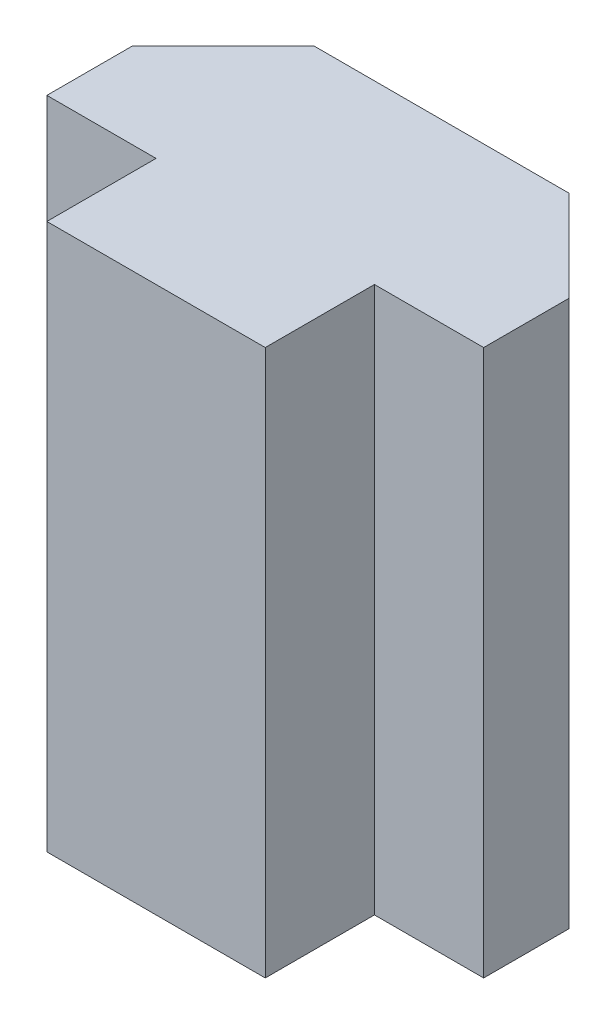
ISO-10303-21;
HEADER;
FILE_DESCRIPTION(('STEP AP214'),'2;1');
FILE_NAME('part.step','',(''),(''),'','','');
FILE_SCHEMA(('AUTOMOTIVE_DESIGN { 1 0 10303 214 1 1 1 1 }'));
ENDSEC;
DATA;
#1=APPLICATION_CONTEXT('core data for automotive mechanical design processes');
#2=APPLICATION_PROTOCOL_DEFINITION('international standard','automotive_design',2000,#1);
#3=PRODUCT_CONTEXT('',#1,'mechanical');
#4=PRODUCT('Part','Part','',(#3));
#5=PRODUCT_RELATED_PRODUCT_CATEGORY('part','',(#4));
#6=PRODUCT_DEFINITION_FORMATION('','',#4);
#7=PRODUCT_DEFINITION_CONTEXT('part definition',#1,'design');
#8=PRODUCT_DEFINITION('design','',#6,#7);
#9=PRODUCT_DEFINITION_SHAPE('','',#8);
#10=(LENGTH_UNIT() NAMED_UNIT(*) SI_UNIT(.MILLI.,.METRE.));
#11=(NAMED_UNIT(*) PLANE_ANGLE_UNIT() SI_UNIT($,.RADIAN.));
#12=(NAMED_UNIT(*) SI_UNIT($,.STERADIAN.) SOLID_ANGLE_UNIT());
#13=UNCERTAINTY_MEASURE_WITH_UNIT(LENGTH_MEASURE(1.E-05),#10,'distance_accuracy_value','');
#14=(GEOMETRIC_REPRESENTATION_CONTEXT(3) GLOBAL_UNCERTAINTY_ASSIGNED_CONTEXT((#13)) GLOBAL_UNIT_ASSIGNED_CONTEXT((#10,
#11,#12)) REPRESENTATION_CONTEXT('',''));
#15=CARTESIAN_POINT('',(0.,0.,0.));
#16=DIRECTION('',(0.,0.,1.));
#17=DIRECTION('',(1.,0.,0.));
#18=AXIS2_PLACEMENT_3D('',#15,#16,#17);
#19=CARTESIAN_POINT('',(-1.74789245707196,0.,0.));
#20=DIRECTION('',(1.,0.,0.));
#21=DIRECTION('',(0.,1.,0.));
#22=AXIS2_PLACEMENT_3D('',#19,#20,#21);
#23=PLANE('',#22);
#24=DIRECTION('',(0.,-1.,0.));
#25=VECTOR('',#24,1.);
#26=CARTESIAN_POINT('',(-1.74789245707196,20.,4.));
#27=LINE('',#26,#25);
#28=CARTESIAN_POINT('',(-1.74789245707196,20.,4.));
#29=VERTEX_POINT('',#28);
#30=CARTESIAN_POINT('',(-1.74789245707196,0.,4.));
#31=VERTEX_POINT('',#30);
#32=EDGE_CURVE('E114',#29,#31,#27,.T.);
#33=ORIENTED_EDGE('',*,*,#32,.F.);
#34=DIRECTION('',(0.,0.,1.));
#35=VECTOR('',#34,1.);
#36=CARTESIAN_POINT('',(-1.74789245707196,20.,0.));
#37=LINE('',#36,#35);
#38=CARTESIAN_POINT('',(-1.74789245707196,20.,0.));
#39=VERTEX_POINT('',#38);
#40=EDGE_CURVE('E180',#39,#29,#37,.T.);
#41=ORIENTED_EDGE('',*,*,#40,.F.);
#42=DIRECTION('',(0.,-1.,0.));
#43=VECTOR('',#42,1.);
#44=CARTESIAN_POINT('',(-1.74789245707197,40.,0.));
#45=LINE('',#44,#43);
#46=CARTESIAN_POINT('',(-1.74789245707196,0.,0.));
#47=VERTEX_POINT('',#46);
#48=EDGE_CURVE('E130',#39,#47,#45,.T.);
#49=ORIENTED_EDGE('',*,*,#48,.T.);
#50=DIRECTION('',(0.,0.,1.));
#51=VECTOR('',#50,1.);
#52=CARTESIAN_POINT('',(-1.74789245707196,0.,5.));
#53=LINE('',#52,#51);
#54=EDGE_CURVE('E126',#47,#31,#53,.T.);
#55=ORIENTED_EDGE('',*,*,#54,.T.);
#56=EDGE_LOOP('',(#33,#41,#49,#55));
#57=FACE_BOUND('',#56,.T.);
#58=ADVANCED_FACE('F38',(#57),#23,.F.);
#59=CARTESIAN_POINT('',(6.25210754292804,0.,0.));
#60=DIRECTION('',(1.,0.,0.));
#61=DIRECTION('',(0.,1.,0.));
#62=AXIS2_PLACEMENT_3D('',#59,#60,#61);
#63=PLANE('',#62);
#64=DIRECTION('',(0.,0.,1.));
#65=VECTOR('',#64,1.);
#66=CARTESIAN_POINT('',(6.25210754292804,20.,0.));
#67=LINE('',#66,#65);
#68=CARTESIAN_POINT('',(6.25210754292804,20.,0.));
#69=VERTEX_POINT('',#68);
#70=CARTESIAN_POINT('',(6.25210754292804,20.,4.));
#71=VERTEX_POINT('',#70);
#72=EDGE_CURVE('E11',#69,#71,#67,.T.);
#73=ORIENTED_EDGE('',*,*,#72,.T.);
#74=DIRECTION('',(0.,1.,0.));
#75=VECTOR('',#74,1.);
#76=CARTESIAN_POINT('',(6.25210754292804,20.,4.));
#77=LINE('',#76,#75);
#78=CARTESIAN_POINT('',(6.25210754292804,0.,4.));
#79=VERTEX_POINT('',#78);
#80=EDGE_CURVE('E53',#79,#71,#77,.T.);
#81=ORIENTED_EDGE('',*,*,#80,.F.);
#82=DIRECTION('',(0.,0.,-1.));
#83=VECTOR('',#82,1.);
#84=CARTESIAN_POINT('',(6.25210754292804,0.,5.));
#85=LINE('',#84,#83);
#86=CARTESIAN_POINT('',(6.25210754292804,0.,0.));
#87=VERTEX_POINT('',#86);
#88=EDGE_CURVE('E60',#79,#87,#85,.T.);
#89=ORIENTED_EDGE('',*,*,#88,.T.);
#90=DIRECTION('',(0.,1.,0.));
#91=VECTOR('',#90,1.);
#92=CARTESIAN_POINT('',(6.25210754292803,40.,0.));
#93=LINE('',#92,#91);
#94=EDGE_CURVE('E136',#87,#69,#93,.T.);
#95=ORIENTED_EDGE('',*,*,#94,.T.);
#96=EDGE_LOOP('',(#73,#81,#89,#95));
#97=FACE_BOUND('',#96,.T.);
#98=ADVANCED_FACE('F194',(#97),#63,.T.);
#99=CARTESIAN_POINT('',(0.,0.,0.));
#100=DIRECTION('',(0.,1.,0.));
#101=DIRECTION('',(0.,0.,1.));
#102=AXIS2_PLACEMENT_3D('',#99,#100,#101);
#103=PLANE('',#102);
#104=DIRECTION('',(1.,0.,0.));
#105=VECTOR('',#104,1.);
#106=CARTESIAN_POINT('',(-1.74789245707196,0.,4.));
#107=LINE('',#106,#105);
#108=EDGE_CURVE('E117',#31,#79,#107,.T.);
#109=ORIENTED_EDGE('',*,*,#108,.F.);
#110=ORIENTED_EDGE('',*,*,#54,.F.);
#111=DIRECTION('',(-1.,0.,0.));
#112=VECTOR('',#111,1.);
#113=CARTESIAN_POINT('',(9.75210754292804,0.,0.));
#114=LINE('',#113,#112);
#115=CARTESIAN_POINT('',(-5.74789245707196,0.,0.));
#116=VERTEX_POINT('',#115);
#117=EDGE_CURVE('E164',#47,#116,#114,.T.);
#118=ORIENTED_EDGE('',*,*,#117,.T.);
#119=DIRECTION('',(0.,0.,1.));
#120=VECTOR('',#119,1.);
#121=CARTESIAN_POINT('',(-5.74789245707196,0.,-2.5));
#122=LINE('',#121,#120);
#123=CARTESIAN_POINT('',(-5.74789245707196,0.,-3.13137084989846));
#124=VERTEX_POINT('',#123);
#125=EDGE_CURVE('E143',#124,#116,#122,.T.);
#126=ORIENTED_EDGE('',*,*,#125,.F.);
#127=DIRECTION('',(0.707106781186544,0.,-0.707106781186551));
#128=VECTOR('',#127,1.);
#129=CARTESIAN_POINT('',(-4.43963165348524,0.,-4.4396316534852));
#130=LINE('',#129,#128);
#131=CARTESIAN_POINT('',(-2.41946533232582,0.,-6.45979797464463));
#132=VERTEX_POINT('',#131);
#133=EDGE_CURVE('E147',#124,#132,#130,.T.);
#134=ORIENTED_EDGE('',*,*,#133,.T.);
#135=DIRECTION('',(1.,0.,0.));
#136=VECTOR('',#135,1.);
#137=CARTESIAN_POINT('',(0.,0.,-6.45979797464463));
#138=LINE('',#137,#136);
#139=CARTESIAN_POINT('',(6.92368041818186,0.,-6.45979797464463));
#140=VERTEX_POINT('',#139);
#141=EDGE_CURVE('E144',#132,#140,#138,.T.);
#142=ORIENTED_EDGE('',*,*,#141,.T.);
#143=DIRECTION('',(0.707106781186549,0.,0.707106781186546));
#144=VECTOR('',#143,1.);
#145=CARTESIAN_POINT('',(6.69173919641323,0.,-6.69173919641326));
#146=LINE('',#145,#144);
#147=CARTESIAN_POINT('',(10.252107542928,0.,-3.13137084989848));
#148=VERTEX_POINT('',#147);
#149=EDGE_CURVE('E140',#140,#148,#146,.T.);
#150=ORIENTED_EDGE('',*,*,#149,.T.);
#151=DIRECTION('',(0.,0.,-1.));
#152=VECTOR('',#151,1.);
#153=CARTESIAN_POINT('',(10.252107542928,0.,-2.5));
#154=LINE('',#153,#152);
#155=CARTESIAN_POINT('',(10.252107542928,0.,0.));
#156=VERTEX_POINT('',#155);
#157=EDGE_CURVE('E162',#156,#148,#154,.T.);
#158=ORIENTED_EDGE('',*,*,#157,.F.);
#159=EDGE_CURVE('E46',#156,#87,#114,.T.);
#160=ORIENTED_EDGE('',*,*,#159,.T.);
#161=ORIENTED_EDGE('',*,*,#88,.F.);
#162=EDGE_LOOP('',(#109,#110,#118,#126,#134,#142,#150,#158,#160,#161));
#163=FACE_BOUND('',#162,.T.);
#164=ADVANCED_FACE('F40',(#163),#103,.F.);
#165=CARTESIAN_POINT('',(0.,20.,-15.));
#166=DIRECTION('',(0.,1.,0.));
#167=DIRECTION('',(0.,0.,1.));
#168=AXIS2_PLACEMENT_3D('',#165,#166,#167);
#169=PLANE('',#168);
#170=ORIENTED_EDGE('',*,*,#40,.T.);
#171=DIRECTION('',(-1.,0.,0.));
#172=VECTOR('',#171,1.);
#173=CARTESIAN_POINT('',(-1.74789245707196,20.,4.));
#174=LINE('',#173,#172);
#175=EDGE_CURVE('E118',#71,#29,#174,.T.);
#176=ORIENTED_EDGE('',*,*,#175,.F.);
#177=ORIENTED_EDGE('',*,*,#72,.F.);
#178=DIRECTION('',(1.,0.,0.));
#179=VECTOR('',#178,1.);
#180=CARTESIAN_POINT('',(0.,20.,0.));
#181=LINE('',#180,#179);
#182=CARTESIAN_POINT('',(10.252107542928,20.,0.));
#183=VERTEX_POINT('',#182);
#184=EDGE_CURVE('E185',#69,#183,#181,.T.);
#185=ORIENTED_EDGE('',*,*,#184,.T.);
#186=DIRECTION('',(0.,0.,1.));
#187=VECTOR('',#186,1.);
#188=CARTESIAN_POINT('',(10.252107542928,20.,-15.));
#189=LINE('',#188,#187);
#190=CARTESIAN_POINT('',(10.252107542928,20.,-3.13137084989848));
#191=VERTEX_POINT('',#190);
#192=EDGE_CURVE('E200',#191,#183,#189,.T.);
#193=ORIENTED_EDGE('',*,*,#192,.F.);
#194=DIRECTION('',(0.707106781186549,0.,0.707106781186546));
#195=VECTOR('',#194,1.);
#196=CARTESIAN_POINT('',(6.69173919641323,20.,-6.69173919641326));
#197=LINE('',#196,#195);
#198=CARTESIAN_POINT('',(6.92368041818186,20.,-6.45979797464463));
#199=VERTEX_POINT('',#198);
#200=EDGE_CURVE('E179',#199,#191,#197,.T.);
#201=ORIENTED_EDGE('',*,*,#200,.F.);
#202=DIRECTION('',(1.,0.,0.));
#203=VECTOR('',#202,1.);
#204=CARTESIAN_POINT('',(0.,20.,-6.45979797464463));
#205=LINE('',#204,#203);
#206=CARTESIAN_POINT('',(-2.41946533232582,20.,-6.45979797464463));
#207=VERTEX_POINT('',#206);
#208=EDGE_CURVE('E183',#207,#199,#205,.T.);
#209=ORIENTED_EDGE('',*,*,#208,.F.);
#210=DIRECTION('',(0.707106781186544,0.,-0.707106781186551));
#211=VECTOR('',#210,1.);
#212=CARTESIAN_POINT('',(-4.43963165348524,20.,-4.4396316534852));
#213=LINE('',#212,#211);
#214=CARTESIAN_POINT('',(-5.74789245707196,20.,-3.13137084989846));
#215=VERTEX_POINT('',#214);
#216=EDGE_CURVE('E191',#215,#207,#213,.T.);
#217=ORIENTED_EDGE('',*,*,#216,.F.);
#218=DIRECTION('',(0.,0.,1.));
#219=VECTOR('',#218,1.);
#220=CARTESIAN_POINT('',(-5.74789245707196,20.,-15.));
#221=LINE('',#220,#219);
#222=CARTESIAN_POINT('',(-5.74789245707196,20.,0.));
#223=VERTEX_POINT('',#222);
#224=EDGE_CURVE('E201',#215,#223,#221,.T.);
#225=ORIENTED_EDGE('',*,*,#224,.T.);
#226=DIRECTION('',(1.,0.,0.));
#227=VECTOR('',#226,1.);
#228=CARTESIAN_POINT('',(0.,20.,0.));
#229=LINE('',#228,#227);
#230=EDGE_CURVE('E177',#223,#39,#229,.T.);
#231=ORIENTED_EDGE('',*,*,#230,.T.);
#232=EDGE_LOOP('',(#170,#176,#177,#185,#193,#201,#209,#217,#225,#231));
#233=FACE_BOUND('',#232,.T.);
#234=ADVANCED_FACE('F206',(#233),#169,.T.);
#235=CARTESIAN_POINT('',(0.,0.,0.));
#236=DIRECTION('',(0.,0.,-1.));
#237=DIRECTION('',(-1.,0.,0.));
#238=AXIS2_PLACEMENT_3D('',#235,#236,#237);
#239=PLANE('',#238);
#240=ORIENTED_EDGE('',*,*,#230,.F.);
#241=DIRECTION('',(0.,1.,0.));
#242=VECTOR('',#241,1.);
#243=CARTESIAN_POINT('',(-5.74789245707196,40.,0.));
#244=LINE('',#243,#242);
#245=EDGE_CURVE('E157',#116,#223,#244,.T.);
#246=ORIENTED_EDGE('',*,*,#245,.F.);
#247=ORIENTED_EDGE('',*,*,#117,.F.);
#248=ORIENTED_EDGE('',*,*,#48,.F.);
#249=EDGE_LOOP('',(#240,#246,#247,#248));
#250=FACE_BOUND('',#249,.T.);
#251=ADVANCED_FACE('F176',(#250),#239,.F.);
#252=ORIENTED_EDGE('',*,*,#184,.F.);
#253=ORIENTED_EDGE('',*,*,#94,.F.);
#254=ORIENTED_EDGE('',*,*,#159,.F.);
#255=DIRECTION('',(0.,-1.,0.));
#256=VECTOR('',#255,1.);
#257=CARTESIAN_POINT('',(10.252107542928,40.,0.));
#258=LINE('',#257,#256);
#259=EDGE_CURVE('E160',#183,#156,#258,.T.);
#260=ORIENTED_EDGE('',*,*,#259,.F.);
#261=EDGE_LOOP('',(#252,#253,#254,#260));
#262=FACE_BOUND('',#261,.T.);
#263=ADVANCED_FACE('F197',(#262),#239,.F.);
#264=CARTESIAN_POINT('',(10.252107542928,0.,0.));
#265=DIRECTION('',(-1.,0.,0.));
#266=DIRECTION('',(0.,-1.,0.));
#267=AXIS2_PLACEMENT_3D('',#264,#265,#266);
#268=PLANE('',#267);
#269=ORIENTED_EDGE('',*,*,#192,.T.);
#270=ORIENTED_EDGE('',*,*,#259,.T.);
#271=ORIENTED_EDGE('',*,*,#157,.T.);
#272=DIRECTION('',(0.,-1.,0.));
#273=VECTOR('',#272,1.);
#274=CARTESIAN_POINT('',(10.252107542928,56.4827182224292,-3.13137084989848));
#275=LINE('',#274,#273);
#276=EDGE_CURVE('E132',#191,#148,#275,.T.);
#277=ORIENTED_EDGE('',*,*,#276,.F.);
#278=EDGE_LOOP('',(#269,#270,#271,#277));
#279=FACE_BOUND('',#278,.T.);
#280=ADVANCED_FACE('F218',(#279),#268,.F.);
#281=CARTESIAN_POINT('',(-5.74789245707196,0.,0.));
#282=DIRECTION('',(-1.,0.,0.));
#283=DIRECTION('',(0.,-1.,0.));
#284=AXIS2_PLACEMENT_3D('',#281,#282,#283);
#285=PLANE('',#284);
#286=ORIENTED_EDGE('',*,*,#245,.T.);
#287=ORIENTED_EDGE('',*,*,#224,.F.);
#288=DIRECTION('',(0.,-1.,0.));
#289=VECTOR('',#288,1.);
#290=CARTESIAN_POINT('',(-5.74789245707196,56.4827182224292,-3.13137084989846));
#291=LINE('',#290,#289);
#292=EDGE_CURVE('E149',#215,#124,#291,.T.);
#293=ORIENTED_EDGE('',*,*,#292,.T.);
#294=ORIENTED_EDGE('',*,*,#125,.T.);
#295=EDGE_LOOP('',(#286,#287,#293,#294));
#296=FACE_BOUND('',#295,.T.);
#297=ADVANCED_FACE('F172',(#296),#285,.T.);
#298=CARTESIAN_POINT('',(-4.43963165348524,56.4827182224292,-4.4396316534852));
#299=DIRECTION('',(-0.707106781186551,0.,-0.707106781186544));
#300=DIRECTION('',(-0.707106781186544,0.,0.707106781186551));
#301=AXIS2_PLACEMENT_3D('',#298,#299,#300);
#302=PLANE('',#301);
#303=ORIENTED_EDGE('',*,*,#292,.F.);
#304=ORIENTED_EDGE('',*,*,#216,.T.);
#305=DIRECTION('',(0.,-1.,0.));
#306=VECTOR('',#305,1.);
#307=CARTESIAN_POINT('',(-2.41946533232582,56.4827182224292,-6.45979797464463));
#308=LINE('',#307,#306);
#309=EDGE_CURVE('E152',#207,#132,#308,.T.);
#310=ORIENTED_EDGE('',*,*,#309,.T.);
#311=ORIENTED_EDGE('',*,*,#133,.F.);
#312=EDGE_LOOP('',(#303,#304,#310,#311));
#313=FACE_BOUND('',#312,.T.);
#314=ADVANCED_FACE('F208',(#313),#302,.T.);
#315=CARTESIAN_POINT('',(0.,56.4827182224292,-6.45979797464463));
#316=DIRECTION('',(0.,0.,-1.));
#317=DIRECTION('',(-1.,0.,0.));
#318=AXIS2_PLACEMENT_3D('',#315,#316,#317);
#319=PLANE('',#318);
#320=ORIENTED_EDGE('',*,*,#309,.F.);
#321=ORIENTED_EDGE('',*,*,#208,.T.);
#322=DIRECTION('',(0.,-1.,0.));
#323=VECTOR('',#322,1.);
#324=CARTESIAN_POINT('',(6.92368041818186,56.4827182224292,-6.45979797464463));
#325=LINE('',#324,#323);
#326=EDGE_CURVE('E134',#199,#140,#325,.T.);
#327=ORIENTED_EDGE('',*,*,#326,.T.);
#328=ORIENTED_EDGE('',*,*,#141,.F.);
#329=EDGE_LOOP('',(#320,#321,#327,#328));
#330=FACE_BOUND('',#329,.T.);
#331=ADVANCED_FACE('F219',(#330),#319,.T.);
#332=CARTESIAN_POINT('',(6.69173919641323,56.4827182224292,-6.69173919641326));
#333=DIRECTION('',(0.707106781186546,0.,-0.707106781186549));
#334=DIRECTION('',(-0.707106781186549,0.,-0.707106781186546));
#335=AXIS2_PLACEMENT_3D('',#332,#333,#334);
#336=PLANE('',#335);
#337=ORIENTED_EDGE('',*,*,#326,.F.);
#338=ORIENTED_EDGE('',*,*,#200,.T.);
#339=ORIENTED_EDGE('',*,*,#276,.T.);
#340=ORIENTED_EDGE('',*,*,#149,.F.);
#341=EDGE_LOOP('',(#337,#338,#339,#340));
#342=FACE_BOUND('',#341,.T.);
#343=ADVANCED_FACE('F215',(#342),#336,.T.);
#344=CARTESIAN_POINT('',(0.,0.,4.));
#345=DIRECTION('',(0.,0.,1.));
#346=DIRECTION('',(1.,0.,0.));
#347=AXIS2_PLACEMENT_3D('',#344,#345,#346);
#348=PLANE('',#347);
#349=ORIENTED_EDGE('',*,*,#32,.T.);
#350=ORIENTED_EDGE('',*,*,#108,.T.);
#351=ORIENTED_EDGE('',*,*,#80,.T.);
#352=ORIENTED_EDGE('',*,*,#175,.T.);
#353=EDGE_LOOP('',(#349,#350,#351,#352));
#354=FACE_BOUND('',#353,.T.);
#355=ADVANCED_FACE('F116',(#354),#348,.T.);
#356=CLOSED_SHELL('',(#58,#98,#164,#234,#251,#263,#280,#297,#314,#331,#343,#355));
#357=MANIFOLD_SOLID_BREP('B2',#356);
#358=ADVANCED_BREP_SHAPE_REPRESENTATION('',(#18,#357),#14);
#359=SHAPE_DEFINITION_REPRESENTATION(#9,#358);
ENDSEC;
END-ISO-10303-21;
